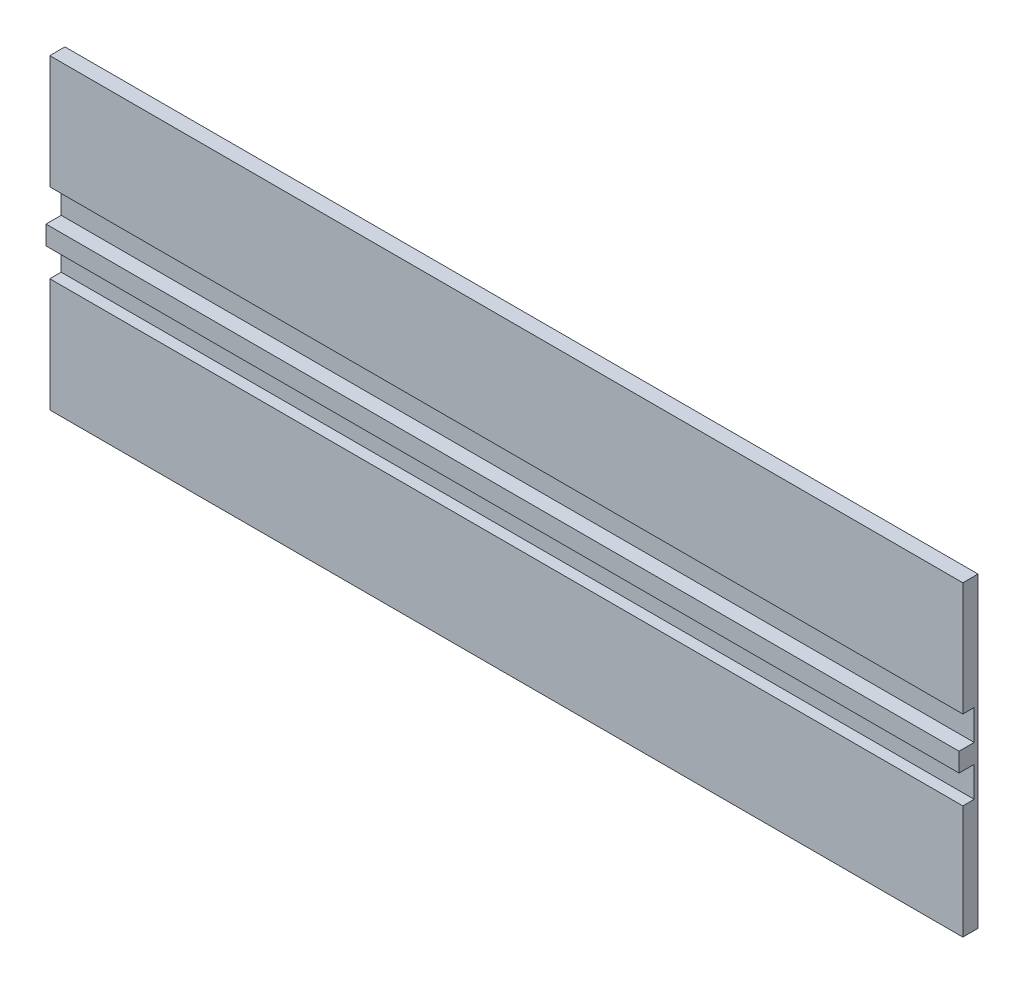
ISO-10303-21;
HEADER;
FILE_DESCRIPTION(('STEP AP214'),'2;1');
FILE_NAME('part.step','',(''),(''),'','','');
FILE_SCHEMA(('AUTOMOTIVE_DESIGN { 1 0 10303 214 1 1 1 1 }'));
ENDSEC;
DATA;
#1=APPLICATION_CONTEXT('core data for automotive mechanical design processes');
#2=APPLICATION_PROTOCOL_DEFINITION('international standard','automotive_design',2000,#1);
#3=PRODUCT_CONTEXT('',#1,'mechanical');
#4=PRODUCT('Part','Part','',(#3));
#5=PRODUCT_RELATED_PRODUCT_CATEGORY('part','',(#4));
#6=PRODUCT_DEFINITION_FORMATION('','',#4);
#7=PRODUCT_DEFINITION_CONTEXT('part definition',#1,'design');
#8=PRODUCT_DEFINITION('design','',#6,#7);
#9=PRODUCT_DEFINITION_SHAPE('','',#8);
#10=(LENGTH_UNIT() NAMED_UNIT(*) SI_UNIT(.MILLI.,.METRE.));
#11=(NAMED_UNIT(*) PLANE_ANGLE_UNIT() SI_UNIT($,.RADIAN.));
#12=(NAMED_UNIT(*) SI_UNIT($,.STERADIAN.) SOLID_ANGLE_UNIT());
#13=UNCERTAINTY_MEASURE_WITH_UNIT(LENGTH_MEASURE(1.E-05),#10,'distance_accuracy_value','');
#14=(GEOMETRIC_REPRESENTATION_CONTEXT(3) GLOBAL_UNCERTAINTY_ASSIGNED_CONTEXT((#13)) GLOBAL_UNIT_ASSIGNED_CONTEXT((#10,
#11,#12)) REPRESENTATION_CONTEXT('',''));
#15=CARTESIAN_POINT('',(0.,0.,0.));
#16=DIRECTION('',(0.,0.,1.));
#17=DIRECTION('',(1.,0.,0.));
#18=AXIS2_PLACEMENT_3D('',#15,#16,#17);
#19=CARTESIAN_POINT('',(0.,2550.,50.));
#20=DIRECTION('',(0.,0.,-1.));
#21=DIRECTION('',(0.,1.,0.));
#22=AXIS2_PLACEMENT_3D('',#19,#20,#21);
#23=PLANE('',#22);
#24=DIRECTION('',(0.,1.,0.));
#25=VECTOR('',#24,1.);
#26=CARTESIAN_POINT('',(12050.,2550.,50.));
#27=LINE('',#26,#25);
#28=CARTESIAN_POINT('',(12050.,1500.,49.9999999999999));
#29=VERTEX_POINT('',#28);
#30=CARTESIAN_POINT('',(12050.,1900.,50.));
#31=VERTEX_POINT('',#30);
#32=EDGE_CURVE('E192',#29,#31,#27,.T.);
#33=ORIENTED_EDGE('',*,*,#32,.T.);
#34=DIRECTION('',(1.,0.,0.));
#35=VECTOR('',#34,1.);
#36=CARTESIAN_POINT('',(0.,1900.,49.9999999999999));
#37=LINE('',#36,#35);
#38=CARTESIAN_POINT('',(0.,1900.,50.));
#39=VERTEX_POINT('',#38);
#40=EDGE_CURVE('E63',#39,#31,#37,.T.);
#41=ORIENTED_EDGE('',*,*,#40,.F.);
#42=DIRECTION('',(0.,1.,0.));
#43=VECTOR('',#42,1.);
#44=CARTESIAN_POINT('',(0.,2550.,50.));
#45=LINE('',#44,#43);
#46=CARTESIAN_POINT('',(0.,1500.,49.9999999999999));
#47=VERTEX_POINT('',#46);
#48=EDGE_CURVE('E180',#47,#39,#45,.T.);
#49=ORIENTED_EDGE('',*,*,#48,.F.);
#50=DIRECTION('',(1.,0.,0.));
#51=VECTOR('',#50,1.);
#52=CARTESIAN_POINT('',(0.,1500.,49.9999999999999));
#53=LINE('',#52,#51);
#54=EDGE_CURVE('E206',#47,#29,#53,.T.);
#55=ORIENTED_EDGE('',*,*,#54,.T.);
#56=EDGE_LOOP('',(#33,#41,#49,#55));
#57=FACE_BOUND('',#56,.T.);
#58=ADVANCED_FACE('F39',(#57),#23,.F.);
#59=CARTESIAN_POINT('',(0.,0.,200.));
#60=DIRECTION('',(0.,0.,-1.));
#61=DIRECTION('',(-1.,0.,0.));
#62=AXIS2_PLACEMENT_3D('',#59,#60,#61);
#63=PLANE('',#62);
#64=DIRECTION('',(0.,-1.,0.));
#65=VECTOR('',#64,1.);
#66=CARTESIAN_POINT('',(0.,0.,200.));
#67=LINE('',#66,#65);
#68=CARTESIAN_POINT('',(0.,4050.,200.));
#69=VERTEX_POINT('',#68);
#70=CARTESIAN_POINT('',(0.,2550.,200.));
#71=VERTEX_POINT('',#70);
#72=EDGE_CURVE('E211',#69,#71,#67,.T.);
#73=ORIENTED_EDGE('',*,*,#72,.T.);
#74=DIRECTION('',(1.,0.,0.));
#75=VECTOR('',#74,1.);
#76=CARTESIAN_POINT('',(0.,2550.,200.));
#77=LINE('',#76,#75);
#78=CARTESIAN_POINT('',(12050.,2550.,200.));
#79=VERTEX_POINT('',#78);
#80=EDGE_CURVE('E197',#71,#79,#77,.T.);
#81=ORIENTED_EDGE('',*,*,#80,.T.);
#82=DIRECTION('',(0.,1.,0.));
#83=VECTOR('',#82,1.);
#84=CARTESIAN_POINT('',(12050.,0.,200.));
#85=LINE('',#84,#83);
#86=CARTESIAN_POINT('',(12050.,4050.,200.));
#87=VERTEX_POINT('',#86);
#88=EDGE_CURVE('E219',#79,#87,#85,.T.);
#89=ORIENTED_EDGE('',*,*,#88,.T.);
#90=DIRECTION('',(-1.,0.,0.));
#91=VECTOR('',#90,1.);
#92=CARTESIAN_POINT('',(0.,4050.,200.));
#93=LINE('',#92,#91);
#94=EDGE_CURVE('E224',#87,#69,#93,.T.);
#95=ORIENTED_EDGE('',*,*,#94,.T.);
#96=EDGE_LOOP('',(#73,#81,#89,#95));
#97=FACE_BOUND('',#96,.T.);
#98=ADVANCED_FACE('F270',(#97),#63,.F.);
#99=CARTESIAN_POINT('',(0.,0.,200.));
#100=DIRECTION('',(1.,0.,0.));
#101=DIRECTION('',(0.,0.,-1.));
#102=AXIS2_PLACEMENT_3D('',#99,#100,#101);
#103=PLANE('',#102);
#104=ORIENTED_EDGE('',*,*,#48,.T.);
#105=DIRECTION('',(0.,0.,-1.));
#106=VECTOR('',#105,1.);
#107=CARTESIAN_POINT('',(0.,1900.,49.9999999999999));
#108=LINE('',#107,#106);
#109=CARTESIAN_POINT('',(0.,1900.,250.));
#110=VERTEX_POINT('',#109);
#111=EDGE_CURVE('E150',#110,#39,#108,.T.);
#112=ORIENTED_EDGE('',*,*,#111,.F.);
#113=DIRECTION('',(0.,-1.,0.));
#114=VECTOR('',#113,1.);
#115=CARTESIAN_POINT('',(0.,2150.,250.));
#116=LINE('',#115,#114);
#117=CARTESIAN_POINT('',(0.,2150.,250.));
#118=VERTEX_POINT('',#117);
#119=EDGE_CURVE('E134',#118,#110,#116,.T.);
#120=ORIENTED_EDGE('',*,*,#119,.F.);
#121=DIRECTION('',(0.,0.,1.));
#122=VECTOR('',#121,1.);
#123=CARTESIAN_POINT('',(0.,2150.,49.9999999999999));
#124=LINE('',#123,#122);
#125=CARTESIAN_POINT('',(0.,2150.,50.));
#126=VERTEX_POINT('',#125);
#127=EDGE_CURVE('E148',#126,#118,#124,.T.);
#128=ORIENTED_EDGE('',*,*,#127,.F.);
#129=CARTESIAN_POINT('',(0.,2550.,50.));
#130=VERTEX_POINT('',#129);
#131=EDGE_CURVE('E55',#126,#130,#45,.T.);
#132=ORIENTED_EDGE('',*,*,#131,.T.);
#133=DIRECTION('',(0.,0.,1.));
#134=VECTOR('',#133,1.);
#135=CARTESIAN_POINT('',(0.,2550.,200.));
#136=LINE('',#135,#134);
#137=EDGE_CURVE('E183',#130,#71,#136,.T.);
#138=ORIENTED_EDGE('',*,*,#137,.T.);
#139=ORIENTED_EDGE('',*,*,#72,.F.);
#140=DIRECTION('',(0.,0.,-1.));
#141=VECTOR('',#140,1.);
#142=CARTESIAN_POINT('',(0.,4050.,200.));
#143=LINE('',#142,#141);
#144=CARTESIAN_POINT('',(0.,4050.,0.));
#145=VERTEX_POINT('',#144);
#146=EDGE_CURVE('E227',#69,#145,#143,.T.);
#147=ORIENTED_EDGE('',*,*,#146,.T.);
#148=DIRECTION('',(0.,-1.,0.));
#149=VECTOR('',#148,1.);
#150=CARTESIAN_POINT('',(0.,0.,0.));
#151=LINE('',#150,#149);
#152=CARTESIAN_POINT('',(0.,0.,0.));
#153=VERTEX_POINT('',#152);
#154=EDGE_CURVE('E201',#145,#153,#151,.T.);
#155=ORIENTED_EDGE('',*,*,#154,.T.);
#156=DIRECTION('',(0.,0.,-1.));
#157=VECTOR('',#156,1.);
#158=CARTESIAN_POINT('',(0.,0.,200.));
#159=LINE('',#158,#157);
#160=CARTESIAN_POINT('',(0.,0.,200.));
#161=VERTEX_POINT('',#160);
#162=EDGE_CURVE('E11',#161,#153,#159,.T.);
#163=ORIENTED_EDGE('',*,*,#162,.F.);
#164=CARTESIAN_POINT('',(0.,1500.,200.));
#165=VERTEX_POINT('',#164);
#166=EDGE_CURVE('E216',#165,#161,#67,.T.);
#167=ORIENTED_EDGE('',*,*,#166,.F.);
#168=DIRECTION('',(0.,0.,-1.));
#169=VECTOR('',#168,1.);
#170=CARTESIAN_POINT('',(0.,1500.,200.));
#171=LINE('',#170,#169);
#172=EDGE_CURVE('E175',#165,#47,#171,.T.);
#173=ORIENTED_EDGE('',*,*,#172,.T.);
#174=EDGE_LOOP('',(#104,#112,#120,#128,#132,#138,#139,#147,#155,#163,#167,#173));
#175=FACE_BOUND('',#174,.T.);
#176=ADVANCED_FACE('F41',(#175),#103,.F.);
#177=CARTESIAN_POINT('',(0.,0.,200.));
#178=DIRECTION('',(0.,1.,0.));
#179=DIRECTION('',(0.,0.,1.));
#180=AXIS2_PLACEMENT_3D('',#177,#178,#179);
#181=PLANE('',#180);
#182=DIRECTION('',(1.,0.,0.));
#183=VECTOR('',#182,1.);
#184=CARTESIAN_POINT('',(0.,0.,0.));
#185=LINE('',#184,#183);
#186=CARTESIAN_POINT('',(12050.,0.,0.));
#187=VERTEX_POINT('',#186);
#188=EDGE_CURVE('E231',#153,#187,#185,.T.);
#189=ORIENTED_EDGE('',*,*,#188,.T.);
#190=DIRECTION('',(0.,0.,-1.));
#191=VECTOR('',#190,1.);
#192=CARTESIAN_POINT('',(12050.,0.,200.));
#193=LINE('',#192,#191);
#194=CARTESIAN_POINT('',(12050.,0.,200.));
#195=VERTEX_POINT('',#194);
#196=EDGE_CURVE('E48',#195,#187,#193,.T.);
#197=ORIENTED_EDGE('',*,*,#196,.F.);
#198=DIRECTION('',(1.,0.,0.));
#199=VECTOR('',#198,1.);
#200=CARTESIAN_POINT('',(0.,0.,200.));
#201=LINE('',#200,#199);
#202=EDGE_CURVE('E215',#161,#195,#201,.T.);
#203=ORIENTED_EDGE('',*,*,#202,.F.);
#204=ORIENTED_EDGE('',*,*,#162,.T.);
#205=EDGE_LOOP('',(#189,#197,#203,#204));
#206=FACE_BOUND('',#205,.T.);
#207=ADVANCED_FACE('F308',(#206),#181,.F.);
#208=CARTESIAN_POINT('',(12050.,0.,200.));
#209=DIRECTION('',(-1.,0.,0.));
#210=DIRECTION('',(0.,0.,1.));
#211=AXIS2_PLACEMENT_3D('',#208,#209,#210);
#212=PLANE('',#211);
#213=ORIENTED_EDGE('',*,*,#88,.F.);
#214=DIRECTION('',(0.,0.,1.));
#215=VECTOR('',#214,1.);
#216=CARTESIAN_POINT('',(12050.,2550.,200.));
#217=LINE('',#216,#215);
#218=CARTESIAN_POINT('',(12050.,2550.,50.));
#219=VERTEX_POINT('',#218);
#220=EDGE_CURVE('E179',#219,#79,#217,.T.);
#221=ORIENTED_EDGE('',*,*,#220,.F.);
#222=CARTESIAN_POINT('',(12050.,2150.,49.9999999999999));
#223=VERTEX_POINT('',#222);
#224=EDGE_CURVE('E191',#223,#219,#27,.T.);
#225=ORIENTED_EDGE('',*,*,#224,.F.);
#226=DIRECTION('',(0.,0.,1.));
#227=VECTOR('',#226,1.);
#228=CARTESIAN_POINT('',(12050.,2150.,49.9999999999999));
#229=LINE('',#228,#227);
#230=CARTESIAN_POINT('',(12050.,2150.,250.));
#231=VERTEX_POINT('',#230);
#232=EDGE_CURVE('E163',#223,#231,#229,.T.);
#233=ORIENTED_EDGE('',*,*,#232,.T.);
#234=DIRECTION('',(0.,-1.,0.));
#235=VECTOR('',#234,1.);
#236=CARTESIAN_POINT('',(12050.,2150.,250.));
#237=LINE('',#236,#235);
#238=CARTESIAN_POINT('',(12050.,1900.,250.));
#239=VERTEX_POINT('',#238);
#240=EDGE_CURVE('E137',#231,#239,#237,.T.);
#241=ORIENTED_EDGE('',*,*,#240,.T.);
#242=DIRECTION('',(0.,0.,-1.));
#243=VECTOR('',#242,1.);
#244=CARTESIAN_POINT('',(12050.,1900.,49.9999999999999));
#245=LINE('',#244,#243);
#246=EDGE_CURVE('E155',#239,#31,#245,.T.);
#247=ORIENTED_EDGE('',*,*,#246,.T.);
#248=ORIENTED_EDGE('',*,*,#32,.F.);
#249=DIRECTION('',(0.,0.,-1.));
#250=VECTOR('',#249,1.);
#251=CARTESIAN_POINT('',(12050.,1500.,200.));
#252=LINE('',#251,#250);
#253=CARTESIAN_POINT('',(12050.,1500.,200.));
#254=VERTEX_POINT('',#253);
#255=EDGE_CURVE('E170',#254,#29,#252,.T.);
#256=ORIENTED_EDGE('',*,*,#255,.F.);
#257=EDGE_CURVE('E220',#195,#254,#85,.T.);
#258=ORIENTED_EDGE('',*,*,#257,.F.);
#259=ORIENTED_EDGE('',*,*,#196,.T.);
#260=DIRECTION('',(0.,1.,0.));
#261=VECTOR('',#260,1.);
#262=CARTESIAN_POINT('',(12050.,0.,0.));
#263=LINE('',#262,#261);
#264=CARTESIAN_POINT('',(12050.,4050.,0.));
#265=VERTEX_POINT('',#264);
#266=EDGE_CURVE('E234',#187,#265,#263,.T.);
#267=ORIENTED_EDGE('',*,*,#266,.T.);
#268=DIRECTION('',(0.,0.,-1.));
#269=VECTOR('',#268,1.);
#270=CARTESIAN_POINT('',(12050.,4050.,200.));
#271=LINE('',#270,#269);
#272=EDGE_CURVE('E243',#87,#265,#271,.T.);
#273=ORIENTED_EDGE('',*,*,#272,.F.);
#274=EDGE_LOOP('',(#213,#221,#225,#233,#241,#247,#248,#256,#258,#259,#267,#273));
#275=FACE_BOUND('',#274,.T.);
#276=ADVANCED_FACE('F253',(#275),#212,.F.);
#277=CARTESIAN_POINT('',(0.,4050.,200.));
#278=DIRECTION('',(0.,-1.,0.));
#279=DIRECTION('',(0.,0.,-1.));
#280=AXIS2_PLACEMENT_3D('',#277,#278,#279);
#281=PLANE('',#280);
#282=DIRECTION('',(-1.,0.,0.));
#283=VECTOR('',#282,1.);
#284=CARTESIAN_POINT('',(0.,4050.,0.));
#285=LINE('',#284,#283);
#286=EDGE_CURVE('E237',#265,#145,#285,.T.);
#287=ORIENTED_EDGE('',*,*,#286,.T.);
#288=ORIENTED_EDGE('',*,*,#146,.F.);
#289=ORIENTED_EDGE('',*,*,#94,.F.);
#290=ORIENTED_EDGE('',*,*,#272,.T.);
#291=EDGE_LOOP('',(#287,#288,#289,#290));
#292=FACE_BOUND('',#291,.T.);
#293=ADVANCED_FACE('F264',(#292),#281,.F.);
#294=ORIENTED_EDGE('',*,*,#257,.T.);
#295=DIRECTION('',(1.,0.,0.));
#296=VECTOR('',#295,1.);
#297=CARTESIAN_POINT('',(0.,1500.,200.));
#298=LINE('',#297,#296);
#299=EDGE_CURVE('E187',#165,#254,#298,.T.);
#300=ORIENTED_EDGE('',*,*,#299,.F.);
#301=ORIENTED_EDGE('',*,*,#166,.T.);
#302=ORIENTED_EDGE('',*,*,#202,.T.);
#303=EDGE_LOOP('',(#294,#300,#301,#302));
#304=FACE_BOUND('',#303,.T.);
#305=ADVANCED_FACE('F288',(#304),#63,.F.);
#306=CARTESIAN_POINT('',(0.,0.,0.));
#307=DIRECTION('',(0.,0.,-1.));
#308=DIRECTION('',(-1.,0.,0.));
#309=AXIS2_PLACEMENT_3D('',#306,#307,#308);
#310=PLANE('',#309);
#311=ORIENTED_EDGE('',*,*,#154,.F.);
#312=ORIENTED_EDGE('',*,*,#286,.F.);
#313=ORIENTED_EDGE('',*,*,#266,.F.);
#314=ORIENTED_EDGE('',*,*,#188,.F.);
#315=EDGE_LOOP('',(#311,#312,#313,#314));
#316=FACE_BOUND('',#315,.T.);
#317=ADVANCED_FACE('F261',(#316),#310,.T.);
#318=CARTESIAN_POINT('',(0.,2550.,200.));
#319=DIRECTION('',(0.,1.,0.));
#320=DIRECTION('',(0.,0.,1.));
#321=AXIS2_PLACEMENT_3D('',#318,#319,#320);
#322=PLANE('',#321);
#323=ORIENTED_EDGE('',*,*,#220,.T.);
#324=ORIENTED_EDGE('',*,*,#80,.F.);
#325=ORIENTED_EDGE('',*,*,#137,.F.);
#326=DIRECTION('',(1.,0.,0.));
#327=VECTOR('',#326,1.);
#328=CARTESIAN_POINT('',(0.,2550.,50.));
#329=LINE('',#328,#327);
#330=EDGE_CURVE('E202',#130,#219,#329,.T.);
#331=ORIENTED_EDGE('',*,*,#330,.T.);
#332=EDGE_LOOP('',(#323,#324,#325,#331));
#333=FACE_BOUND('',#332,.T.);
#334=ADVANCED_FACE('F278',(#333),#322,.F.);
#335=ORIENTED_EDGE('',*,*,#131,.F.);
#336=DIRECTION('',(1.,0.,0.));
#337=VECTOR('',#336,1.);
#338=CARTESIAN_POINT('',(0.,2150.,49.9999999999999));
#339=LINE('',#338,#337);
#340=EDGE_CURVE('E144',#126,#223,#339,.T.);
#341=ORIENTED_EDGE('',*,*,#340,.T.);
#342=ORIENTED_EDGE('',*,*,#224,.T.);
#343=ORIENTED_EDGE('',*,*,#330,.F.);
#344=EDGE_LOOP('',(#335,#341,#342,#343));
#345=FACE_BOUND('',#344,.T.);
#346=ADVANCED_FACE('F276',(#345),#23,.F.);
#347=CARTESIAN_POINT('',(0.,1500.,200.));
#348=DIRECTION('',(0.,-1.,0.));
#349=DIRECTION('',(0.,0.,-1.));
#350=AXIS2_PLACEMENT_3D('',#347,#348,#349);
#351=PLANE('',#350);
#352=ORIENTED_EDGE('',*,*,#255,.T.);
#353=ORIENTED_EDGE('',*,*,#54,.F.);
#354=ORIENTED_EDGE('',*,*,#172,.F.);
#355=ORIENTED_EDGE('',*,*,#299,.T.);
#356=EDGE_LOOP('',(#352,#353,#354,#355));
#357=FACE_BOUND('',#356,.T.);
#358=ADVANCED_FACE('F286',(#357),#351,.F.);
#359=CARTESIAN_POINT('',(0.,1900.,49.9999999999999));
#360=DIRECTION('',(0.,-1.,0.));
#361=DIRECTION('',(0.,0.,-1.));
#362=AXIS2_PLACEMENT_3D('',#359,#360,#361);
#363=PLANE('',#362);
#364=ORIENTED_EDGE('',*,*,#246,.F.);
#365=DIRECTION('',(1.,0.,0.));
#366=VECTOR('',#365,1.);
#367=CARTESIAN_POINT('',(0.,1900.,250.));
#368=LINE('',#367,#366);
#369=EDGE_CURVE('E143',#110,#239,#368,.T.);
#370=ORIENTED_EDGE('',*,*,#369,.F.);
#371=ORIENTED_EDGE('',*,*,#111,.T.);
#372=ORIENTED_EDGE('',*,*,#40,.T.);
#373=EDGE_LOOP('',(#364,#370,#371,#372));
#374=FACE_BOUND('',#373,.T.);
#375=ADVANCED_FACE('F300',(#374),#363,.T.);
#376=CARTESIAN_POINT('',(0.,2150.,250.));
#377=DIRECTION('',(0.,0.,1.));
#378=DIRECTION('',(0.,-1.,0.));
#379=AXIS2_PLACEMENT_3D('',#376,#377,#378);
#380=PLANE('',#379);
#381=ORIENTED_EDGE('',*,*,#240,.F.);
#382=DIRECTION('',(1.,0.,0.));
#383=VECTOR('',#382,1.);
#384=CARTESIAN_POINT('',(0.,2150.,250.));
#385=LINE('',#384,#383);
#386=EDGE_CURVE('E131',#118,#231,#385,.T.);
#387=ORIENTED_EDGE('',*,*,#386,.F.);
#388=ORIENTED_EDGE('',*,*,#119,.T.);
#389=ORIENTED_EDGE('',*,*,#369,.T.);
#390=EDGE_LOOP('',(#381,#387,#388,#389));
#391=FACE_BOUND('',#390,.T.);
#392=ADVANCED_FACE('F133',(#391),#380,.T.);
#393=CARTESIAN_POINT('',(0.,2150.,49.9999999999999));
#394=DIRECTION('',(0.,1.,0.));
#395=DIRECTION('',(0.,0.,1.));
#396=AXIS2_PLACEMENT_3D('',#393,#394,#395);
#397=PLANE('',#396);
#398=ORIENTED_EDGE('',*,*,#232,.F.);
#399=ORIENTED_EDGE('',*,*,#340,.F.);
#400=ORIENTED_EDGE('',*,*,#127,.T.);
#401=ORIENTED_EDGE('',*,*,#386,.T.);
#402=EDGE_LOOP('',(#398,#399,#400,#401));
#403=FACE_BOUND('',#402,.T.);
#404=ADVANCED_FACE('F153',(#403),#397,.T.);
#405=CLOSED_SHELL('',(#58,#98,#176,#207,#276,#293,#305,#317,#334,#346,#358,#375,#392,#404));
#406=MANIFOLD_SOLID_BREP('B2',#405);
#407=ADVANCED_BREP_SHAPE_REPRESENTATION('',(#18,#406),#14);
#408=SHAPE_DEFINITION_REPRESENTATION(#9,#407);
ENDSEC;
END-ISO-10303-21;
